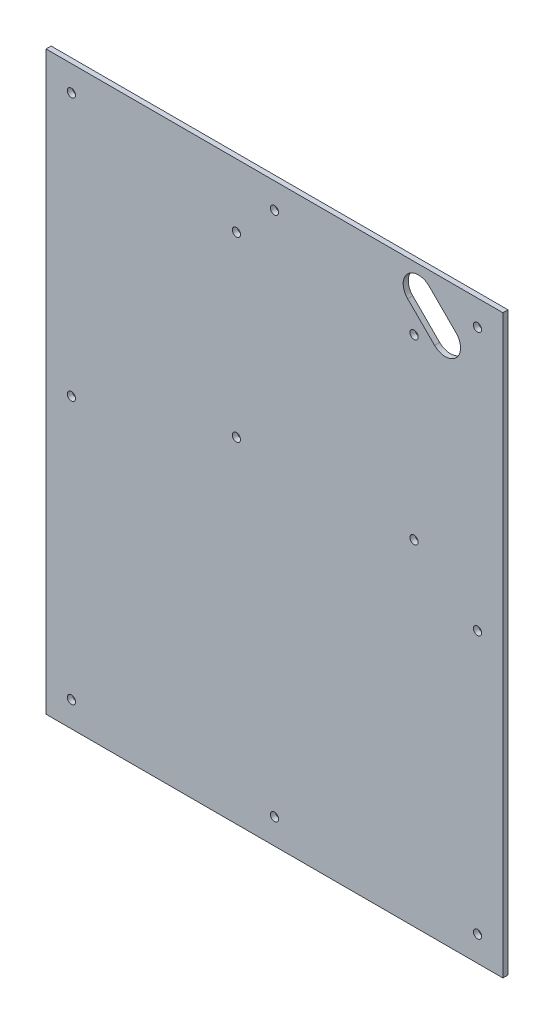
ISO-10303-21;
HEADER;
FILE_DESCRIPTION(('STEP AP214'),'2;1');
FILE_NAME('part.step','',(''),(''),'','','');
FILE_SCHEMA(('AUTOMOTIVE_DESIGN { 1 0 10303 214 1 1 1 1 }'));
ENDSEC;
DATA;
#1=APPLICATION_CONTEXT('core data for automotive mechanical design processes');
#2=APPLICATION_PROTOCOL_DEFINITION('international standard','automotive_design',2000,#1);
#3=PRODUCT_CONTEXT('',#1,'mechanical');
#4=PRODUCT('Part','Part','',(#3));
#5=PRODUCT_RELATED_PRODUCT_CATEGORY('part','',(#4));
#6=PRODUCT_DEFINITION_FORMATION('','',#4);
#7=PRODUCT_DEFINITION_CONTEXT('part definition',#1,'design');
#8=PRODUCT_DEFINITION('design','',#6,#7);
#9=PRODUCT_DEFINITION_SHAPE('','',#8);
#10=(LENGTH_UNIT() NAMED_UNIT(*) SI_UNIT(.MILLI.,.METRE.));
#11=(NAMED_UNIT(*) PLANE_ANGLE_UNIT() SI_UNIT($,.RADIAN.));
#12=(NAMED_UNIT(*) SI_UNIT($,.STERADIAN.) SOLID_ANGLE_UNIT());
#13=UNCERTAINTY_MEASURE_WITH_UNIT(LENGTH_MEASURE(1.E-05),#10,'distance_accuracy_value','');
#14=(GEOMETRIC_REPRESENTATION_CONTEXT(3) GLOBAL_UNCERTAINTY_ASSIGNED_CONTEXT((#13)) GLOBAL_UNIT_ASSIGNED_CONTEXT((#10,
#11,#12)) REPRESENTATION_CONTEXT('',''));
#15=CARTESIAN_POINT('',(0.,0.,0.));
#16=DIRECTION('',(0.,0.,1.));
#17=DIRECTION('',(1.,0.,0.));
#18=AXIS2_PLACEMENT_3D('',#15,#16,#17);
#19=CARTESIAN_POINT('',(0.,0.,2.));
#20=DIRECTION('',(0.,0.,1.));
#21=DIRECTION('',(1.,0.,0.));
#22=AXIS2_PLACEMENT_3D('',#19,#20,#21);
#23=PLANE('',#22);
#24=CARTESIAN_POINT('',(80.,0.,2.));
#25=DIRECTION('',(0.,0.,1.));
#26=DIRECTION('',(1.,0.,0.));
#27=AXIS2_PLACEMENT_3D('',#24,#25,#26);
#28=CIRCLE('',#27,1.625);
#29=CARTESIAN_POINT('',(81.625,0.,2.));
#30=VERTEX_POINT('',#29);
#31=EDGE_CURVE('E141',#30,#30,#28,.T.);
#32=ORIENTED_EDGE('',*,*,#31,.F.);
#33=EDGE_LOOP('',(#32));
#34=FACE_BOUND('',#33,.T.);
#35=CARTESIAN_POINT('',(0.,-103.5,2.));
#36=DIRECTION('',(0.,0.,1.));
#37=DIRECTION('',(1.,0.,0.));
#38=AXIS2_PLACEMENT_3D('',#35,#36,#37);
#39=CIRCLE('',#38,1.625);
#40=CARTESIAN_POINT('',(1.62499999999998,-103.5,2.));
#41=VERTEX_POINT('',#40);
#42=EDGE_CURVE('E153',#41,#41,#39,.T.);
#43=ORIENTED_EDGE('',*,*,#42,.F.);
#44=EDGE_LOOP('',(#43));
#45=FACE_BOUND('',#44,.T.);
#46=CARTESIAN_POINT('',(80.,103.5,2.));
#47=DIRECTION('',(0.,0.,1.));
#48=DIRECTION('',(1.,0.,0.));
#49=AXIS2_PLACEMENT_3D('',#46,#47,#48);
#50=CIRCLE('',#49,1.625);
#51=CARTESIAN_POINT('',(81.625,103.5,2.));
#52=VERTEX_POINT('',#51);
#53=EDGE_CURVE('E165',#52,#52,#50,.T.);
#54=ORIENTED_EDGE('',*,*,#53,.F.);
#55=EDGE_LOOP('',(#54));
#56=FACE_BOUND('',#55,.T.);
#57=CARTESIAN_POINT('',(-80.,103.5,2.));
#58=DIRECTION('',(0.,0.,1.));
#59=DIRECTION('',(1.,0.,0.));
#60=AXIS2_PLACEMENT_3D('',#57,#58,#59);
#61=CIRCLE('',#60,1.625);
#62=CARTESIAN_POINT('',(-78.375,103.5,2.));
#63=VERTEX_POINT('',#62);
#64=EDGE_CURVE('E177',#63,#63,#61,.T.);
#65=ORIENTED_EDGE('',*,*,#64,.F.);
#66=EDGE_LOOP('',(#65));
#67=FACE_BOUND('',#66,.T.);
#68=CARTESIAN_POINT('',(55.,18.5,2.));
#69=DIRECTION('',(0.,0.,1.));
#70=DIRECTION('',(1.,0.,0.));
#71=AXIS2_PLACEMENT_3D('',#68,#69,#70);
#72=CIRCLE('',#71,1.625);
#73=CARTESIAN_POINT('',(56.625,18.5,2.));
#74=VERTEX_POINT('',#73);
#75=EDGE_CURVE('E189',#74,#74,#72,.T.);
#76=ORIENTED_EDGE('',*,*,#75,.F.);
#77=EDGE_LOOP('',(#76));
#78=FACE_BOUND('',#77,.T.);
#79=CARTESIAN_POINT('',(-15.,88.4999999999999,2.));
#80=DIRECTION('',(0.,0.,1.));
#81=DIRECTION('',(1.,0.,0.));
#82=AXIS2_PLACEMENT_3D('',#79,#80,#81);
#83=CIRCLE('',#82,1.62500000000001);
#84=CARTESIAN_POINT('',(-13.375,88.4999999999999,2.));
#85=VERTEX_POINT('',#84);
#86=EDGE_CURVE('E201',#85,#85,#83,.T.);
#87=ORIENTED_EDGE('',*,*,#86,.F.);
#88=EDGE_LOOP('',(#87));
#89=FACE_BOUND('',#88,.T.);
#90=DIRECTION('',(0.,-1.,0.));
#91=VECTOR('',#90,1.);
#92=CARTESIAN_POINT('',(-90.,-113.5,2.));
#93=LINE('',#92,#91);
#94=CARTESIAN_POINT('',(-90.,113.5,2.));
#95=VERTEX_POINT('',#94);
#96=CARTESIAN_POINT('',(-90.,-113.5,2.));
#97=VERTEX_POINT('',#96);
#98=EDGE_CURVE('E207',#95,#97,#93,.T.);
#99=ORIENTED_EDGE('',*,*,#98,.T.);
#100=DIRECTION('',(1.,0.,0.));
#101=VECTOR('',#100,1.);
#102=CARTESIAN_POINT('',(90.,-113.5,2.));
#103=LINE('',#102,#101);
#104=CARTESIAN_POINT('',(90.,-113.5,2.));
#105=VERTEX_POINT('',#104);
#106=EDGE_CURVE('E210',#97,#105,#103,.T.);
#107=ORIENTED_EDGE('',*,*,#106,.T.);
#108=DIRECTION('',(0.,1.,0.));
#109=VECTOR('',#108,1.);
#110=CARTESIAN_POINT('',(90.,-113.5,2.));
#111=LINE('',#110,#109);
#112=CARTESIAN_POINT('',(90.,113.5,2.));
#113=VERTEX_POINT('',#112);
#114=EDGE_CURVE('E213',#105,#113,#111,.T.);
#115=ORIENTED_EDGE('',*,*,#114,.T.);
#116=DIRECTION('',(-1.,0.,0.));
#117=VECTOR('',#116,1.);
#118=CARTESIAN_POINT('',(90.,113.5,2.));
#119=LINE('',#118,#117);
#120=EDGE_CURVE('E215',#113,#95,#119,.T.);
#121=ORIENTED_EDGE('',*,*,#120,.T.);
#122=EDGE_LOOP('',(#99,#107,#115,#121));
#123=FACE_BOUND('',#122,.T.);
#124=CARTESIAN_POINT('',(55.,88.5,2.));
#125=DIRECTION('',(0.,0.,1.));
#126=DIRECTION('',(1.,0.,0.));
#127=AXIS2_PLACEMENT_3D('',#124,#125,#126);
#128=CIRCLE('',#127,1.625);
#129=CARTESIAN_POINT('',(56.625,88.5,2.));
#130=VERTEX_POINT('',#129);
#131=EDGE_CURVE('E195',#130,#130,#128,.T.);
#132=ORIENTED_EDGE('',*,*,#131,.F.);
#133=EDGE_LOOP('',(#132));
#134=FACE_BOUND('',#133,.T.);
#135=CARTESIAN_POINT('',(-15.,18.5,2.));
#136=DIRECTION('',(0.,0.,1.));
#137=DIRECTION('',(1.,0.,0.));
#138=AXIS2_PLACEMENT_3D('',#135,#136,#137);
#139=CIRCLE('',#138,1.62500000000001);
#140=CARTESIAN_POINT('',(-13.375,18.5,2.));
#141=VERTEX_POINT('',#140);
#142=EDGE_CURVE('E183',#141,#141,#139,.T.);
#143=ORIENTED_EDGE('',*,*,#142,.F.);
#144=EDGE_LOOP('',(#143));
#145=FACE_BOUND('',#144,.T.);
#146=CARTESIAN_POINT('',(0.,103.5,2.));
#147=DIRECTION('',(0.,0.,1.));
#148=DIRECTION('',(1.,0.,0.));
#149=AXIS2_PLACEMENT_3D('',#146,#147,#148);
#150=CIRCLE('',#149,1.625);
#151=CARTESIAN_POINT('',(1.62499999999998,103.5,2.));
#152=VERTEX_POINT('',#151);
#153=EDGE_CURVE('E171',#152,#152,#150,.T.);
#154=ORIENTED_EDGE('',*,*,#153,.F.);
#155=EDGE_LOOP('',(#154));
#156=FACE_BOUND('',#155,.T.);
#157=CARTESIAN_POINT('',(80.,-103.5,2.));
#158=DIRECTION('',(0.,0.,1.));
#159=DIRECTION('',(1.,0.,0.));
#160=AXIS2_PLACEMENT_3D('',#157,#158,#159);
#161=CIRCLE('',#160,1.625);
#162=CARTESIAN_POINT('',(81.625,-103.5,2.));
#163=VERTEX_POINT('',#162);
#164=EDGE_CURVE('E159',#163,#163,#161,.T.);
#165=ORIENTED_EDGE('',*,*,#164,.F.);
#166=EDGE_LOOP('',(#165));
#167=FACE_BOUND('',#166,.T.);
#168=CARTESIAN_POINT('',(-80.,-103.5,2.));
#169=DIRECTION('',(0.,0.,1.));
#170=DIRECTION('',(1.,0.,0.));
#171=AXIS2_PLACEMENT_3D('',#168,#169,#170);
#172=CIRCLE('',#171,1.625);
#173=CARTESIAN_POINT('',(-78.375,-103.5,2.));
#174=VERTEX_POINT('',#173);
#175=EDGE_CURVE('E147',#174,#174,#172,.T.);
#176=ORIENTED_EDGE('',*,*,#175,.F.);
#177=EDGE_LOOP('',(#176));
#178=FACE_BOUND('',#177,.T.);
#179=CARTESIAN_POINT('',(-80.,0.,2.));
#180=DIRECTION('',(0.,0.,1.));
#181=DIRECTION('',(1.,0.,0.));
#182=AXIS2_PLACEMENT_3D('',#179,#180,#181);
#183=CIRCLE('',#182,1.625);
#184=CARTESIAN_POINT('',(-78.375,0.,2.));
#185=VERTEX_POINT('',#184);
#186=EDGE_CURVE('E135',#185,#185,#183,.T.);
#187=ORIENTED_EDGE('',*,*,#186,.F.);
#188=EDGE_LOOP('',(#187));
#189=FACE_BOUND('',#188,.T.);
#190=DIRECTION('',(-0.70710678118655,0.707106781186545,0.));
#191=VECTOR('',#190,1.);
#192=CARTESIAN_POINT('',(60.9548120209259,108.00103210179,2.));
#193=LINE('',#192,#191);
#194=CARTESIAN_POINT('',(71.5614137387242,97.3944303839915,2.));
#195=VERTEX_POINT('',#194);
#196=CARTESIAN_POINT('',(60.9548120209259,108.00103210179,2.));
#197=VERTEX_POINT('',#196);
#198=EDGE_CURVE('E107',#195,#197,#193,.T.);
#199=ORIENTED_EDGE('',*,*,#198,.F.);
#200=CARTESIAN_POINT('',(67.3187730516049,93.1517896968722,2.));
#201=DIRECTION('',(0.,0.,1.));
#202=DIRECTION('',(-1.,0.,0.));
#203=AXIS2_PLACEMENT_3D('',#200,#201,#202);
#204=CIRCLE('',#203,6.);
#205=CARTESIAN_POINT('',(63.0761323644857,88.9091490097529,2.));
#206=VERTEX_POINT('',#205);
#207=EDGE_CURVE('E99',#206,#195,#204,.T.);
#208=ORIENTED_EDGE('',*,*,#207,.F.);
#209=DIRECTION('',(0.70710678118655,-0.707106781186545,0.));
#210=VECTOR('',#209,1.);
#211=CARTESIAN_POINT('',(63.0761323644857,88.9091490097529,2.));
#212=LINE('',#211,#210);
#213=CARTESIAN_POINT('',(52.4695306466874,99.515750727551,2.));
#214=VERTEX_POINT('',#213);
#215=EDGE_CURVE('E121',#214,#206,#212,.T.);
#216=ORIENTED_EDGE('',*,*,#215,.F.);
#217=CARTESIAN_POINT('',(56.7121713338067,103.75839141467,2.));
#218=DIRECTION('',(0.,0.,1.));
#219=DIRECTION('',(-1.,0.,0.));
#220=AXIS2_PLACEMENT_3D('',#217,#218,#219);
#221=CIRCLE('',#220,6.);
#222=EDGE_CURVE('E119',#197,#214,#221,.T.);
#223=ORIENTED_EDGE('',*,*,#222,.F.);
#224=EDGE_LOOP('',(#199,#208,#216,#223));
#225=FACE_BOUND('',#224,.T.);
#226=ADVANCED_FACE('F34',(#34,#45,#56,#67,#78,#89,#123,#134,#145,#156,#167,#178,#189,#225),#23,.T.);
#227=CARTESIAN_POINT('',(0.,0.,0.));
#228=DIRECTION('',(0.,0.,1.));
#229=DIRECTION('',(1.,0.,0.));
#230=AXIS2_PLACEMENT_3D('',#227,#228,#229);
#231=PLANE('',#230);
#232=CARTESIAN_POINT('',(-80.,0.,0.));
#233=DIRECTION('',(0.,0.,1.));
#234=DIRECTION('',(1.,0.,0.));
#235=AXIS2_PLACEMENT_3D('',#232,#233,#234);
#236=CIRCLE('',#235,1.625);
#237=CARTESIAN_POINT('',(-78.375,0.,0.));
#238=VERTEX_POINT('',#237);
#239=EDGE_CURVE('E115',#238,#238,#236,.T.);
#240=ORIENTED_EDGE('',*,*,#239,.T.);
#241=EDGE_LOOP('',(#240));
#242=FACE_BOUND('',#241,.T.);
#243=CARTESIAN_POINT('',(80.,0.,0.));
#244=DIRECTION('',(0.,0.,1.));
#245=DIRECTION('',(1.,0.,0.));
#246=AXIS2_PLACEMENT_3D('',#243,#244,#245);
#247=CIRCLE('',#246,1.625);
#248=CARTESIAN_POINT('',(81.625,0.,0.));
#249=VERTEX_POINT('',#248);
#250=EDGE_CURVE('E138',#249,#249,#247,.T.);
#251=ORIENTED_EDGE('',*,*,#250,.T.);
#252=EDGE_LOOP('',(#251));
#253=FACE_BOUND('',#252,.T.);
#254=CARTESIAN_POINT('',(-80.,-103.5,0.));
#255=DIRECTION('',(0.,0.,1.));
#256=DIRECTION('',(1.,0.,0.));
#257=AXIS2_PLACEMENT_3D('',#254,#255,#256);
#258=CIRCLE('',#257,1.625);
#259=CARTESIAN_POINT('',(-78.375,-103.5,0.));
#260=VERTEX_POINT('',#259);
#261=EDGE_CURVE('E144',#260,#260,#258,.T.);
#262=ORIENTED_EDGE('',*,*,#261,.T.);
#263=EDGE_LOOP('',(#262));
#264=FACE_BOUND('',#263,.T.);
#265=CARTESIAN_POINT('',(0.,-103.5,0.));
#266=DIRECTION('',(0.,0.,1.));
#267=DIRECTION('',(1.,0.,0.));
#268=AXIS2_PLACEMENT_3D('',#265,#266,#267);
#269=CIRCLE('',#268,1.625);
#270=CARTESIAN_POINT('',(1.62499999999998,-103.5,0.));
#271=VERTEX_POINT('',#270);
#272=EDGE_CURVE('E150',#271,#271,#269,.T.);
#273=ORIENTED_EDGE('',*,*,#272,.T.);
#274=EDGE_LOOP('',(#273));
#275=FACE_BOUND('',#274,.T.);
#276=CARTESIAN_POINT('',(80.,-103.5,0.));
#277=DIRECTION('',(0.,0.,1.));
#278=DIRECTION('',(1.,0.,0.));
#279=AXIS2_PLACEMENT_3D('',#276,#277,#278);
#280=CIRCLE('',#279,1.625);
#281=CARTESIAN_POINT('',(81.625,-103.5,0.));
#282=VERTEX_POINT('',#281);
#283=EDGE_CURVE('E156',#282,#282,#280,.T.);
#284=ORIENTED_EDGE('',*,*,#283,.T.);
#285=EDGE_LOOP('',(#284));
#286=FACE_BOUND('',#285,.T.);
#287=CARTESIAN_POINT('',(80.,103.5,0.));
#288=DIRECTION('',(0.,0.,1.));
#289=DIRECTION('',(1.,0.,0.));
#290=AXIS2_PLACEMENT_3D('',#287,#288,#289);
#291=CIRCLE('',#290,1.625);
#292=CARTESIAN_POINT('',(81.625,103.5,0.));
#293=VERTEX_POINT('',#292);
#294=EDGE_CURVE('E162',#293,#293,#291,.T.);
#295=ORIENTED_EDGE('',*,*,#294,.T.);
#296=EDGE_LOOP('',(#295));
#297=FACE_BOUND('',#296,.T.);
#298=CARTESIAN_POINT('',(0.,103.5,0.));
#299=DIRECTION('',(0.,0.,1.));
#300=DIRECTION('',(1.,0.,0.));
#301=AXIS2_PLACEMENT_3D('',#298,#299,#300);
#302=CIRCLE('',#301,1.625);
#303=CARTESIAN_POINT('',(1.62499999999998,103.5,0.));
#304=VERTEX_POINT('',#303);
#305=EDGE_CURVE('E168',#304,#304,#302,.T.);
#306=ORIENTED_EDGE('',*,*,#305,.T.);
#307=EDGE_LOOP('',(#306));
#308=FACE_BOUND('',#307,.T.);
#309=CARTESIAN_POINT('',(-80.,103.5,0.));
#310=DIRECTION('',(0.,0.,1.));
#311=DIRECTION('',(1.,0.,0.));
#312=AXIS2_PLACEMENT_3D('',#309,#310,#311);
#313=CIRCLE('',#312,1.625);
#314=CARTESIAN_POINT('',(-78.375,103.5,0.));
#315=VERTEX_POINT('',#314);
#316=EDGE_CURVE('E174',#315,#315,#313,.T.);
#317=ORIENTED_EDGE('',*,*,#316,.T.);
#318=EDGE_LOOP('',(#317));
#319=FACE_BOUND('',#318,.T.);
#320=CARTESIAN_POINT('',(-15.,18.5,0.));
#321=DIRECTION('',(0.,0.,1.));
#322=DIRECTION('',(1.,0.,0.));
#323=AXIS2_PLACEMENT_3D('',#320,#321,#322);
#324=CIRCLE('',#323,1.62500000000001);
#325=CARTESIAN_POINT('',(-13.375,18.5,0.));
#326=VERTEX_POINT('',#325);
#327=EDGE_CURVE('E180',#326,#326,#324,.T.);
#328=ORIENTED_EDGE('',*,*,#327,.T.);
#329=EDGE_LOOP('',(#328));
#330=FACE_BOUND('',#329,.T.);
#331=CARTESIAN_POINT('',(55.,18.5,0.));
#332=DIRECTION('',(0.,0.,1.));
#333=DIRECTION('',(1.,0.,0.));
#334=AXIS2_PLACEMENT_3D('',#331,#332,#333);
#335=CIRCLE('',#334,1.625);
#336=CARTESIAN_POINT('',(56.625,18.5,0.));
#337=VERTEX_POINT('',#336);
#338=EDGE_CURVE('E186',#337,#337,#335,.T.);
#339=ORIENTED_EDGE('',*,*,#338,.T.);
#340=EDGE_LOOP('',(#339));
#341=FACE_BOUND('',#340,.T.);
#342=CARTESIAN_POINT('',(55.,88.5,0.));
#343=DIRECTION('',(0.,0.,1.));
#344=DIRECTION('',(1.,0.,0.));
#345=AXIS2_PLACEMENT_3D('',#342,#343,#344);
#346=CIRCLE('',#345,1.625);
#347=CARTESIAN_POINT('',(56.625,88.5,0.));
#348=VERTEX_POINT('',#347);
#349=EDGE_CURVE('E192',#348,#348,#346,.T.);
#350=ORIENTED_EDGE('',*,*,#349,.T.);
#351=EDGE_LOOP('',(#350));
#352=FACE_BOUND('',#351,.T.);
#353=CARTESIAN_POINT('',(-15.,88.4999999999999,0.));
#354=DIRECTION('',(0.,0.,1.));
#355=DIRECTION('',(1.,0.,0.));
#356=AXIS2_PLACEMENT_3D('',#353,#354,#355);
#357=CIRCLE('',#356,1.62500000000001);
#358=CARTESIAN_POINT('',(-13.375,88.4999999999999,0.));
#359=VERTEX_POINT('',#358);
#360=EDGE_CURVE('E198',#359,#359,#357,.T.);
#361=ORIENTED_EDGE('',*,*,#360,.T.);
#362=EDGE_LOOP('',(#361));
#363=FACE_BOUND('',#362,.T.);
#364=DIRECTION('',(0.,-1.,0.));
#365=VECTOR('',#364,1.);
#366=CARTESIAN_POINT('',(-90.,-113.5,0.));
#367=LINE('',#366,#365);
#368=CARTESIAN_POINT('',(-90.,113.5,0.));
#369=VERTEX_POINT('',#368);
#370=CARTESIAN_POINT('',(-90.,-113.5,0.));
#371=VERTEX_POINT('',#370);
#372=EDGE_CURVE('E204',#369,#371,#367,.T.);
#373=ORIENTED_EDGE('',*,*,#372,.F.);
#374=DIRECTION('',(-1.,0.,0.));
#375=VECTOR('',#374,1.);
#376=CARTESIAN_POINT('',(90.,113.5,0.));
#377=LINE('',#376,#375);
#378=CARTESIAN_POINT('',(90.,113.5,0.));
#379=VERTEX_POINT('',#378);
#380=EDGE_CURVE('E211',#379,#369,#377,.T.);
#381=ORIENTED_EDGE('',*,*,#380,.F.);
#382=DIRECTION('',(0.,1.,0.));
#383=VECTOR('',#382,1.);
#384=CARTESIAN_POINT('',(90.,-113.5,0.));
#385=LINE('',#384,#383);
#386=CARTESIAN_POINT('',(90.,-113.5,0.));
#387=VERTEX_POINT('',#386);
#388=EDGE_CURVE('E222',#387,#379,#385,.T.);
#389=ORIENTED_EDGE('',*,*,#388,.F.);
#390=DIRECTION('',(1.,0.,0.));
#391=VECTOR('',#390,1.);
#392=CARTESIAN_POINT('',(90.,-113.5,0.));
#393=LINE('',#392,#391);
#394=EDGE_CURVE('E220',#371,#387,#393,.T.);
#395=ORIENTED_EDGE('',*,*,#394,.F.);
#396=EDGE_LOOP('',(#373,#381,#389,#395));
#397=FACE_BOUND('',#396,.T.);
#398=CARTESIAN_POINT('',(67.3187730516049,93.1517896968722,0.));
#399=DIRECTION('',(0.,0.,1.));
#400=DIRECTION('',(-1.,0.,0.));
#401=AXIS2_PLACEMENT_3D('',#398,#399,#400);
#402=CIRCLE('',#401,6.);
#403=CARTESIAN_POINT('',(63.0761323644856,88.9091490097529,0.));
#404=VERTEX_POINT('',#403);
#405=CARTESIAN_POINT('',(71.5614137387242,97.3944303839915,0.));
#406=VERTEX_POINT('',#405);
#407=EDGE_CURVE('E57',#404,#406,#402,.T.);
#408=ORIENTED_EDGE('',*,*,#407,.T.);
#409=DIRECTION('',(-0.70710678118655,0.707106781186545,0.));
#410=VECTOR('',#409,1.);
#411=CARTESIAN_POINT('',(60.9548120209259,108.00103210179,0.));
#412=LINE('',#411,#410);
#413=CARTESIAN_POINT('',(60.9548120209259,108.00103210179,0.));
#414=VERTEX_POINT('',#413);
#415=EDGE_CURVE('E114',#406,#414,#412,.T.);
#416=ORIENTED_EDGE('',*,*,#415,.T.);
#417=CARTESIAN_POINT('',(56.7121713338067,103.75839141467,0.));
#418=DIRECTION('',(0.,0.,1.));
#419=DIRECTION('',(-1.,0.,0.));
#420=AXIS2_PLACEMENT_3D('',#417,#418,#419);
#421=CIRCLE('',#420,6.);
#422=CARTESIAN_POINT('',(52.4695306466874,99.5157507275511,0.));
#423=VERTEX_POINT('',#422);
#424=EDGE_CURVE('E127',#414,#423,#421,.T.);
#425=ORIENTED_EDGE('',*,*,#424,.T.);
#426=DIRECTION('',(0.70710678118655,-0.707106781186545,0.));
#427=VECTOR('',#426,1.);
#428=CARTESIAN_POINT('',(63.0761323644857,88.9091490097529,0.));
#429=LINE('',#428,#427);
#430=EDGE_CURVE('E108',#423,#404,#429,.T.);
#431=ORIENTED_EDGE('',*,*,#430,.T.);
#432=EDGE_LOOP('',(#408,#416,#425,#431));
#433=FACE_BOUND('',#432,.T.);
#434=ADVANCED_FACE('F240',(#242,#253,#264,#275,#286,#297,#308,#319,#330,#341,#352,#363,#397,
#433),#231,.F.);
#435=CARTESIAN_POINT('',(-90.,-113.5,2.));
#436=DIRECTION('',(1.,0.,0.));
#437=DIRECTION('',(0.,0.,-1.));
#438=AXIS2_PLACEMENT_3D('',#435,#436,#437);
#439=PLANE('',#438);
#440=ORIENTED_EDGE('',*,*,#372,.T.);
#441=DIRECTION('',(0.,0.,-1.));
#442=VECTOR('',#441,1.);
#443=CARTESIAN_POINT('',(-90.,-113.5,2.));
#444=LINE('',#443,#442);
#445=EDGE_CURVE('E11',#97,#371,#444,.T.);
#446=ORIENTED_EDGE('',*,*,#445,.F.);
#447=ORIENTED_EDGE('',*,*,#98,.F.);
#448=DIRECTION('',(0.,0.,-1.));
#449=VECTOR('',#448,1.);
#450=CARTESIAN_POINT('',(-90.,113.5,2.));
#451=LINE('',#450,#449);
#452=EDGE_CURVE('E217',#95,#369,#451,.T.);
#453=ORIENTED_EDGE('',*,*,#452,.T.);
#454=EDGE_LOOP('',(#440,#446,#447,#453));
#455=FACE_BOUND('',#454,.T.);
#456=ADVANCED_FACE('F36',(#455),#439,.F.);
#457=CARTESIAN_POINT('',(90.,-113.5,2.));
#458=DIRECTION('',(0.,1.,0.));
#459=DIRECTION('',(0.,0.,1.));
#460=AXIS2_PLACEMENT_3D('',#457,#458,#459);
#461=PLANE('',#460);
#462=ORIENTED_EDGE('',*,*,#394,.T.);
#463=DIRECTION('',(0.,0.,-1.));
#464=VECTOR('',#463,1.);
#465=CARTESIAN_POINT('',(90.,-113.5,2.));
#466=LINE('',#465,#464);
#467=EDGE_CURVE('E42',#105,#387,#466,.T.);
#468=ORIENTED_EDGE('',*,*,#467,.F.);
#469=ORIENTED_EDGE('',*,*,#106,.F.);
#470=ORIENTED_EDGE('',*,*,#445,.T.);
#471=EDGE_LOOP('',(#462,#468,#469,#470));
#472=FACE_BOUND('',#471,.T.);
#473=ADVANCED_FACE('F251',(#472),#461,.F.);
#474=CARTESIAN_POINT('',(90.,-113.5,2.));
#475=DIRECTION('',(-1.,0.,0.));
#476=DIRECTION('',(0.,0.,1.));
#477=AXIS2_PLACEMENT_3D('',#474,#475,#476);
#478=PLANE('',#477);
#479=ORIENTED_EDGE('',*,*,#388,.T.);
#480=DIRECTION('',(0.,0.,-1.));
#481=VECTOR('',#480,1.);
#482=CARTESIAN_POINT('',(90.,113.5,2.));
#483=LINE('',#482,#481);
#484=EDGE_CURVE('E227',#113,#379,#483,.T.);
#485=ORIENTED_EDGE('',*,*,#484,.F.);
#486=ORIENTED_EDGE('',*,*,#114,.F.);
#487=ORIENTED_EDGE('',*,*,#467,.T.);
#488=EDGE_LOOP('',(#479,#485,#486,#487));
#489=FACE_BOUND('',#488,.T.);
#490=ADVANCED_FACE('F234',(#489),#478,.F.);
#491=CARTESIAN_POINT('',(90.,113.5,2.));
#492=DIRECTION('',(0.,-1.,0.));
#493=DIRECTION('',(0.,0.,-1.));
#494=AXIS2_PLACEMENT_3D('',#491,#492,#493);
#495=PLANE('',#494);
#496=ORIENTED_EDGE('',*,*,#380,.T.);
#497=ORIENTED_EDGE('',*,*,#452,.F.);
#498=ORIENTED_EDGE('',*,*,#120,.F.);
#499=ORIENTED_EDGE('',*,*,#484,.T.);
#500=EDGE_LOOP('',(#496,#497,#498,#499));
#501=FACE_BOUND('',#500,.T.);
#502=ADVANCED_FACE('F244',(#501),#495,.F.);
#503=CARTESIAN_POINT('',(-15.,88.4999999999999,2.));
#504=DIRECTION('',(0.,0.,-1.));
#505=DIRECTION('',(-1.,0.,0.));
#506=AXIS2_PLACEMENT_3D('',#503,#504,#505);
#507=CYLINDRICAL_SURFACE('',#506,1.62500000000001);
#508=ORIENTED_EDGE('',*,*,#86,.T.);
#509=EDGE_LOOP('',(#508));
#510=FACE_BOUND('',#509,.T.);
#511=ORIENTED_EDGE('',*,*,#360,.F.);
#512=EDGE_LOOP('',(#511));
#513=FACE_BOUND('',#512,.T.);
#514=ADVANCED_FACE('F269',(#510,#513),#507,.F.);
#515=CARTESIAN_POINT('',(55.,88.5,2.));
#516=DIRECTION('',(0.,0.,-1.));
#517=DIRECTION('',(-1.,0.,0.));
#518=AXIS2_PLACEMENT_3D('',#515,#516,#517);
#519=CYLINDRICAL_SURFACE('',#518,1.625);
#520=ORIENTED_EDGE('',*,*,#131,.T.);
#521=EDGE_LOOP('',(#520));
#522=FACE_BOUND('',#521,.T.);
#523=ORIENTED_EDGE('',*,*,#349,.F.);
#524=EDGE_LOOP('',(#523));
#525=FACE_BOUND('',#524,.T.);
#526=ADVANCED_FACE('F276',(#522,#525),#519,.F.);
#527=CARTESIAN_POINT('',(55.,18.5,2.));
#528=DIRECTION('',(0.,0.,-1.));
#529=DIRECTION('',(-1.,0.,0.));
#530=AXIS2_PLACEMENT_3D('',#527,#528,#529);
#531=CYLINDRICAL_SURFACE('',#530,1.625);
#532=ORIENTED_EDGE('',*,*,#75,.T.);
#533=EDGE_LOOP('',(#532));
#534=FACE_BOUND('',#533,.T.);
#535=ORIENTED_EDGE('',*,*,#338,.F.);
#536=EDGE_LOOP('',(#535));
#537=FACE_BOUND('',#536,.T.);
#538=ADVANCED_FACE('F281',(#534,#537),#531,.F.);
#539=CARTESIAN_POINT('',(-15.,18.5,2.));
#540=DIRECTION('',(0.,0.,-1.));
#541=DIRECTION('',(-1.,0.,0.));
#542=AXIS2_PLACEMENT_3D('',#539,#540,#541);
#543=CYLINDRICAL_SURFACE('',#542,1.62500000000001);
#544=ORIENTED_EDGE('',*,*,#142,.T.);
#545=EDGE_LOOP('',(#544));
#546=FACE_BOUND('',#545,.T.);
#547=ORIENTED_EDGE('',*,*,#327,.F.);
#548=EDGE_LOOP('',(#547));
#549=FACE_BOUND('',#548,.T.);
#550=ADVANCED_FACE('F291',(#546,#549),#543,.F.);
#551=CARTESIAN_POINT('',(-80.,103.5,2.));
#552=DIRECTION('',(0.,0.,-1.));
#553=DIRECTION('',(-1.,0.,0.));
#554=AXIS2_PLACEMENT_3D('',#551,#552,#553);
#555=CYLINDRICAL_SURFACE('',#554,1.625);
#556=ORIENTED_EDGE('',*,*,#64,.T.);
#557=EDGE_LOOP('',(#556));
#558=FACE_BOUND('',#557,.T.);
#559=ORIENTED_EDGE('',*,*,#316,.F.);
#560=EDGE_LOOP('',(#559));
#561=FACE_BOUND('',#560,.T.);
#562=ADVANCED_FACE('F298',(#558,#561),#555,.F.);
#563=CARTESIAN_POINT('',(0.,103.5,2.));
#564=DIRECTION('',(0.,0.,-1.));
#565=DIRECTION('',(-1.,0.,0.));
#566=AXIS2_PLACEMENT_3D('',#563,#564,#565);
#567=CYLINDRICAL_SURFACE('',#566,1.625);
#568=ORIENTED_EDGE('',*,*,#153,.T.);
#569=EDGE_LOOP('',(#568));
#570=FACE_BOUND('',#569,.T.);
#571=ORIENTED_EDGE('',*,*,#305,.F.);
#572=EDGE_LOOP('',(#571));
#573=FACE_BOUND('',#572,.T.);
#574=ADVANCED_FACE('F302',(#570,#573),#567,.F.);
#575=CARTESIAN_POINT('',(80.,103.5,2.));
#576=DIRECTION('',(0.,0.,-1.));
#577=DIRECTION('',(-1.,0.,0.));
#578=AXIS2_PLACEMENT_3D('',#575,#576,#577);
#579=CYLINDRICAL_SURFACE('',#578,1.625);
#580=ORIENTED_EDGE('',*,*,#53,.T.);
#581=EDGE_LOOP('',(#580));
#582=FACE_BOUND('',#581,.T.);
#583=ORIENTED_EDGE('',*,*,#294,.F.);
#584=EDGE_LOOP('',(#583));
#585=FACE_BOUND('',#584,.T.);
#586=ADVANCED_FACE('F306',(#582,#585),#579,.F.);
#587=CARTESIAN_POINT('',(80.,-103.5,2.));
#588=DIRECTION('',(0.,0.,-1.));
#589=DIRECTION('',(-1.,0.,0.));
#590=AXIS2_PLACEMENT_3D('',#587,#588,#589);
#591=CYLINDRICAL_SURFACE('',#590,1.625);
#592=ORIENTED_EDGE('',*,*,#164,.T.);
#593=EDGE_LOOP('',(#592));
#594=FACE_BOUND('',#593,.T.);
#595=ORIENTED_EDGE('',*,*,#283,.F.);
#596=EDGE_LOOP('',(#595));
#597=FACE_BOUND('',#596,.T.);
#598=ADVANCED_FACE('F310',(#594,#597),#591,.F.);
#599=CARTESIAN_POINT('',(0.,-103.5,2.));
#600=DIRECTION('',(0.,0.,-1.));
#601=DIRECTION('',(-1.,0.,0.));
#602=AXIS2_PLACEMENT_3D('',#599,#600,#601);
#603=CYLINDRICAL_SURFACE('',#602,1.625);
#604=ORIENTED_EDGE('',*,*,#42,.T.);
#605=EDGE_LOOP('',(#604));
#606=FACE_BOUND('',#605,.T.);
#607=ORIENTED_EDGE('',*,*,#272,.F.);
#608=EDGE_LOOP('',(#607));
#609=FACE_BOUND('',#608,.T.);
#610=ADVANCED_FACE('F314',(#606,#609),#603,.F.);
#611=CARTESIAN_POINT('',(-80.,-103.5,2.));
#612=DIRECTION('',(0.,0.,-1.));
#613=DIRECTION('',(-1.,0.,0.));
#614=AXIS2_PLACEMENT_3D('',#611,#612,#613);
#615=CYLINDRICAL_SURFACE('',#614,1.625);
#616=ORIENTED_EDGE('',*,*,#175,.T.);
#617=EDGE_LOOP('',(#616));
#618=FACE_BOUND('',#617,.T.);
#619=ORIENTED_EDGE('',*,*,#261,.F.);
#620=EDGE_LOOP('',(#619));
#621=FACE_BOUND('',#620,.T.);
#622=ADVANCED_FACE('F318',(#618,#621),#615,.F.);
#623=CARTESIAN_POINT('',(80.,0.,2.));
#624=DIRECTION('',(0.,0.,-1.));
#625=DIRECTION('',(-1.,0.,0.));
#626=AXIS2_PLACEMENT_3D('',#623,#624,#625);
#627=CYLINDRICAL_SURFACE('',#626,1.625);
#628=ORIENTED_EDGE('',*,*,#31,.T.);
#629=EDGE_LOOP('',(#628));
#630=FACE_BOUND('',#629,.T.);
#631=ORIENTED_EDGE('',*,*,#250,.F.);
#632=EDGE_LOOP('',(#631));
#633=FACE_BOUND('',#632,.T.);
#634=ADVANCED_FACE('F322',(#630,#633),#627,.F.);
#635=CARTESIAN_POINT('',(-80.,0.,2.));
#636=DIRECTION('',(0.,0.,-1.));
#637=DIRECTION('',(-1.,0.,0.));
#638=AXIS2_PLACEMENT_3D('',#635,#636,#637);
#639=CYLINDRICAL_SURFACE('',#638,1.625);
#640=ORIENTED_EDGE('',*,*,#186,.T.);
#641=EDGE_LOOP('',(#640));
#642=FACE_BOUND('',#641,.T.);
#643=ORIENTED_EDGE('',*,*,#239,.F.);
#644=EDGE_LOOP('',(#643));
#645=FACE_BOUND('',#644,.T.);
#646=ADVANCED_FACE('F326',(#642,#645),#639,.F.);
#647=CARTESIAN_POINT('',(67.3187730516049,93.1517896968722,2.));
#648=DIRECTION('',(0.,0.,-1.));
#649=DIRECTION('',(-1.,0.,0.));
#650=AXIS2_PLACEMENT_3D('',#647,#648,#649);
#651=CYLINDRICAL_SURFACE('',#650,6.);
#652=ORIENTED_EDGE('',*,*,#407,.F.);
#653=DIRECTION('',(0.,0.,-1.));
#654=VECTOR('',#653,1.);
#655=CARTESIAN_POINT('',(63.0761323644857,88.9091490097529,2.));
#656=LINE('',#655,#654);
#657=EDGE_CURVE('E103',#206,#404,#656,.T.);
#658=ORIENTED_EDGE('',*,*,#657,.F.);
#659=ORIENTED_EDGE('',*,*,#207,.T.);
#660=DIRECTION('',(0.,0.,-1.));
#661=VECTOR('',#660,1.);
#662=CARTESIAN_POINT('',(71.5614137387242,97.3944303839915,2.));
#663=LINE('',#662,#661);
#664=EDGE_CURVE('E102',#195,#406,#663,.T.);
#665=ORIENTED_EDGE('',*,*,#664,.T.);
#666=EDGE_LOOP('',(#652,#658,#659,#665));
#667=FACE_BOUND('',#666,.T.);
#668=ADVANCED_FACE('F101',(#667),#651,.F.);
#669=CARTESIAN_POINT('',(60.9548120209259,108.00103210179,2.));
#670=DIRECTION('',(-0.707106781186545,-0.70710678118655,0.));
#671=DIRECTION('',(0.70710678118655,-0.707106781186545,0.));
#672=AXIS2_PLACEMENT_3D('',#669,#670,#671);
#673=PLANE('',#672);
#674=ORIENTED_EDGE('',*,*,#415,.F.);
#675=ORIENTED_EDGE('',*,*,#664,.F.);
#676=ORIENTED_EDGE('',*,*,#198,.T.);
#677=DIRECTION('',(0.,0.,-1.));
#678=VECTOR('',#677,1.);
#679=CARTESIAN_POINT('',(60.9548120209259,108.00103210179,2.));
#680=LINE('',#679,#678);
#681=EDGE_CURVE('E116',#197,#414,#680,.T.);
#682=ORIENTED_EDGE('',*,*,#681,.T.);
#683=EDGE_LOOP('',(#674,#675,#676,#682));
#684=FACE_BOUND('',#683,.T.);
#685=ADVANCED_FACE('F111',(#684),#673,.T.);
#686=CARTESIAN_POINT('',(56.7121713338067,103.75839141467,2.));
#687=DIRECTION('',(0.,0.,-1.));
#688=DIRECTION('',(-1.,0.,0.));
#689=AXIS2_PLACEMENT_3D('',#686,#687,#688);
#690=CYLINDRICAL_SURFACE('',#689,6.);
#691=ORIENTED_EDGE('',*,*,#424,.F.);
#692=ORIENTED_EDGE('',*,*,#681,.F.);
#693=ORIENTED_EDGE('',*,*,#222,.T.);
#694=DIRECTION('',(0.,0.,-1.));
#695=VECTOR('',#694,1.);
#696=CARTESIAN_POINT('',(52.4695306466874,99.5157507275511,2.));
#697=LINE('',#696,#695);
#698=EDGE_CURVE('E49',#214,#423,#697,.T.);
#699=ORIENTED_EDGE('',*,*,#698,.T.);
#700=EDGE_LOOP('',(#691,#692,#693,#699));
#701=FACE_BOUND('',#700,.T.);
#702=ADVANCED_FACE('F335',(#701),#690,.F.);
#703=CARTESIAN_POINT('',(63.0761323644857,88.9091490097529,2.));
#704=DIRECTION('',(0.707106781186545,0.70710678118655,0.));
#705=DIRECTION('',(-0.70710678118655,0.707106781186545,0.));
#706=AXIS2_PLACEMENT_3D('',#703,#704,#705);
#707=PLANE('',#706);
#708=ORIENTED_EDGE('',*,*,#430,.F.);
#709=ORIENTED_EDGE('',*,*,#698,.F.);
#710=ORIENTED_EDGE('',*,*,#215,.T.);
#711=ORIENTED_EDGE('',*,*,#657,.T.);
#712=EDGE_LOOP('',(#708,#709,#710,#711));
#713=FACE_BOUND('',#712,.T.);
#714=ADVANCED_FACE('F338',(#713),#707,.T.);
#715=CLOSED_SHELL('',(#226,#434,#456,#473,#490,#502,#514,#526,#538,#550,#562,#574,#586,#598,
#610,#622,#634,#646,#668,#685,#702,#714));
#716=MANIFOLD_SOLID_BREP('B2',#715);
#717=ADVANCED_BREP_SHAPE_REPRESENTATION('',(#18,#716),#14);
#718=SHAPE_DEFINITION_REPRESENTATION(#9,#717);
ENDSEC;
END-ISO-10303-21;
